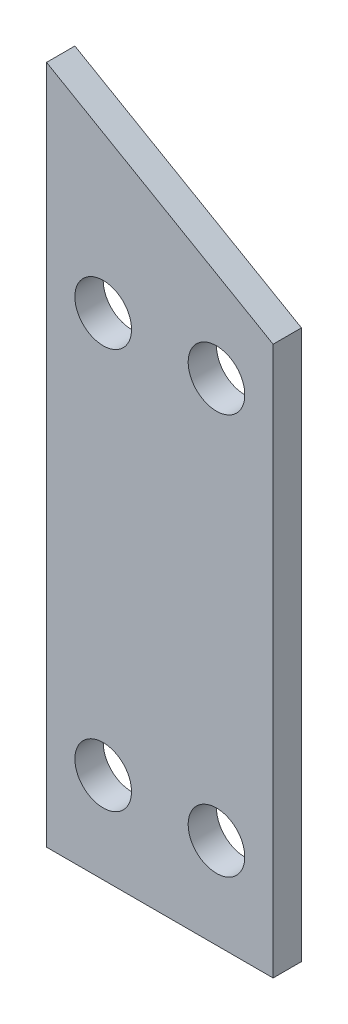
ISO-10303-21;
HEADER;
FILE_DESCRIPTION(('STEP AP214'),'2;1');
FILE_NAME('part.step','',(''),(''),'','','');
FILE_SCHEMA(('AUTOMOTIVE_DESIGN { 1 0 10303 214 1 1 1 1 }'));
ENDSEC;
DATA;
#1=APPLICATION_CONTEXT('core data for automotive mechanical design processes');
#2=APPLICATION_PROTOCOL_DEFINITION('international standard','automotive_design',2000,#1);
#3=PRODUCT_CONTEXT('',#1,'mechanical');
#4=PRODUCT('Part','Part','',(#3));
#5=PRODUCT_RELATED_PRODUCT_CATEGORY('part','',(#4));
#6=PRODUCT_DEFINITION_FORMATION('','',#4);
#7=PRODUCT_DEFINITION_CONTEXT('part definition',#1,'design');
#8=PRODUCT_DEFINITION('design','',#6,#7);
#9=PRODUCT_DEFINITION_SHAPE('','',#8);
#10=(LENGTH_UNIT() NAMED_UNIT(*) SI_UNIT(.MILLI.,.METRE.));
#11=(NAMED_UNIT(*) PLANE_ANGLE_UNIT() SI_UNIT($,.RADIAN.));
#12=(NAMED_UNIT(*) SI_UNIT($,.STERADIAN.) SOLID_ANGLE_UNIT());
#13=UNCERTAINTY_MEASURE_WITH_UNIT(LENGTH_MEASURE(1.E-05),#10,'distance_accuracy_value','');
#14=(GEOMETRIC_REPRESENTATION_CONTEXT(3) GLOBAL_UNCERTAINTY_ASSIGNED_CONTEXT((#13)) GLOBAL_UNIT_ASSIGNED_CONTEXT((#10,
#11,#12)) REPRESENTATION_CONTEXT('',''));
#15=CARTESIAN_POINT('',(0.,0.,0.));
#16=DIRECTION('',(0.,0.,1.));
#17=DIRECTION('',(1.,0.,0.));
#18=AXIS2_PLACEMENT_3D('',#15,#16,#17);
#19=CARTESIAN_POINT('',(0.,0.,4.7625));
#20=DIRECTION('',(0.,0.,-1.));
#21=DIRECTION('',(-1.,0.,0.));
#22=AXIS2_PLACEMENT_3D('',#19,#20,#21);
#23=PLANE('',#22);
#24=DIRECTION('',(0.,1.,0.));
#25=VECTOR('',#24,1.);
#26=CARTESIAN_POINT('',(0.,92.3029547438757,4.7625));
#27=LINE('',#26,#25);
#28=CARTESIAN_POINT('',(0.,0.,4.7625));
#29=VERTEX_POINT('',#28);
#30=CARTESIAN_POINT('',(0.,92.3029547438757,4.7625));
#31=VERTEX_POINT('',#30);
#32=EDGE_CURVE('E96',#29,#31,#27,.T.);
#33=ORIENTED_EDGE('',*,*,#32,.T.);
#34=DIRECTION('',(-0.866025403784443,0.499999999999992,0.));
#35=VECTOR('',#34,1.);
#36=CARTESIAN_POINT('',(-38.1,114.3,4.7625));
#37=LINE('',#36,#35);
#38=CARTESIAN_POINT('',(-38.1,114.3,4.7625));
#39=VERTEX_POINT('',#38);
#40=EDGE_CURVE('E91',#31,#39,#37,.T.);
#41=ORIENTED_EDGE('',*,*,#40,.T.);
#42=DIRECTION('',(0.,-1.,0.));
#43=VECTOR('',#42,1.);
#44=CARTESIAN_POINT('',(-38.1,0.,4.7625));
#45=LINE('',#44,#43);
#46=CARTESIAN_POINT('',(-38.1,0.,4.7625));
#47=VERTEX_POINT('',#46);
#48=EDGE_CURVE('E94',#39,#47,#45,.T.);
#49=ORIENTED_EDGE('',*,*,#48,.T.);
#50=DIRECTION('',(1.,0.,0.));
#51=VECTOR('',#50,1.);
#52=CARTESIAN_POINT('',(0.,0.,4.7625));
#53=LINE('',#52,#51);
#54=EDGE_CURVE('E61',#47,#29,#53,.T.);
#55=ORIENTED_EDGE('',*,*,#54,.T.);
#56=EDGE_LOOP('',(#33,#41,#49,#55));
#57=FACE_BOUND('',#56,.T.);
#58=CARTESIAN_POINT('',(-28.575,15.24,4.7625));
#59=DIRECTION('',(0.,0.,1.));
#60=DIRECTION('',(1.,0.,0.));
#61=AXIS2_PLACEMENT_3D('',#58,#59,#60);
#62=CIRCLE('',#61,4.7625);
#63=CARTESIAN_POINT('',(-33.3375,15.24,4.7625));
#64=VERTEX_POINT('',#63);
#65=EDGE_CURVE('E116',#64,#64,#62,.T.);
#66=ORIENTED_EDGE('',*,*,#65,.F.);
#67=EDGE_LOOP('',(#66));
#68=FACE_BOUND('',#67,.T.);
#69=CARTESIAN_POINT('',(-9.52499999999999,15.24,4.7625));
#70=DIRECTION('',(0.,0.,1.));
#71=DIRECTION('',(1.,0.,0.));
#72=AXIS2_PLACEMENT_3D('',#69,#70,#71);
#73=CIRCLE('',#72,4.7625);
#74=CARTESIAN_POINT('',(-14.2875,15.24,4.7625));
#75=VERTEX_POINT('',#74);
#76=EDGE_CURVE('E138',#75,#75,#73,.T.);
#77=ORIENTED_EDGE('',*,*,#76,.F.);
#78=EDGE_LOOP('',(#77));
#79=FACE_BOUND('',#78,.T.);
#80=CARTESIAN_POINT('',(-9.52499999999998,82.55,4.7625));
#81=DIRECTION('',(0.,0.,1.));
#82=DIRECTION('',(1.,0.,0.));
#83=AXIS2_PLACEMENT_3D('',#80,#81,#82);
#84=CIRCLE('',#83,4.76249999999999);
#85=CARTESIAN_POINT('',(-14.2875,82.55,4.7625));
#86=VERTEX_POINT('',#85);
#87=EDGE_CURVE('E146',#86,#86,#84,.T.);
#88=ORIENTED_EDGE('',*,*,#87,.F.);
#89=EDGE_LOOP('',(#88));
#90=FACE_BOUND('',#89,.T.);
#91=CARTESIAN_POINT('',(-28.575,82.55,4.7625));
#92=DIRECTION('',(0.,0.,1.));
#93=DIRECTION('',(1.,0.,0.));
#94=AXIS2_PLACEMENT_3D('',#91,#92,#93);
#95=CIRCLE('',#94,4.7625);
#96=CARTESIAN_POINT('',(-33.3375,82.55,4.7625));
#97=VERTEX_POINT('',#96);
#98=EDGE_CURVE('E154',#97,#97,#95,.T.);
#99=ORIENTED_EDGE('',*,*,#98,.F.);
#100=EDGE_LOOP('',(#99));
#101=FACE_BOUND('',#100,.T.);
#102=ADVANCED_FACE('F43',(#57,#68,#79,#90,#101),#23,.F.);
#103=CARTESIAN_POINT('',(0.,0.,0.));
#104=DIRECTION('',(0.,0.,-1.));
#105=DIRECTION('',(-1.,0.,0.));
#106=AXIS2_PLACEMENT_3D('',#103,#104,#105);
#107=PLANE('',#106);
#108=CARTESIAN_POINT('',(-9.52499999999998,82.55,0.));
#109=DIRECTION('',(0.,0.,1.));
#110=DIRECTION('',(1.,0.,0.));
#111=AXIS2_PLACEMENT_3D('',#108,#109,#110);
#112=CIRCLE('',#111,4.76249999999999);
#113=CARTESIAN_POINT('',(-14.2875,82.55,0.));
#114=VERTEX_POINT('',#113);
#115=EDGE_CURVE('E150',#114,#114,#112,.T.);
#116=ORIENTED_EDGE('',*,*,#115,.T.);
#117=EDGE_LOOP('',(#116));
#118=FACE_BOUND('',#117,.T.);
#119=CARTESIAN_POINT('',(-28.575,15.24,0.));
#120=DIRECTION('',(0.,0.,1.));
#121=DIRECTION('',(1.,0.,0.));
#122=AXIS2_PLACEMENT_3D('',#119,#120,#121);
#123=CIRCLE('',#122,4.7625);
#124=CARTESIAN_POINT('',(-33.3375,15.24,0.));
#125=VERTEX_POINT('',#124);
#126=EDGE_CURVE('E134',#125,#125,#123,.T.);
#127=ORIENTED_EDGE('',*,*,#126,.T.);
#128=EDGE_LOOP('',(#127));
#129=FACE_BOUND('',#128,.T.);
#130=DIRECTION('',(0.,1.,0.));
#131=VECTOR('',#130,1.);
#132=CARTESIAN_POINT('',(0.,92.3029547438757,0.));
#133=LINE('',#132,#131);
#134=CARTESIAN_POINT('',(0.,0.,0.));
#135=VERTEX_POINT('',#134);
#136=CARTESIAN_POINT('',(0.,92.3029547438757,0.));
#137=VERTEX_POINT('',#136);
#138=EDGE_CURVE('E112',#135,#137,#133,.T.);
#139=ORIENTED_EDGE('',*,*,#138,.F.);
#140=DIRECTION('',(1.,0.,0.));
#141=VECTOR('',#140,1.);
#142=CARTESIAN_POINT('',(0.,0.,0.));
#143=LINE('',#142,#141);
#144=CARTESIAN_POINT('',(-38.1,0.,0.));
#145=VERTEX_POINT('',#144);
#146=EDGE_CURVE('E84',#145,#135,#143,.T.);
#147=ORIENTED_EDGE('',*,*,#146,.F.);
#148=DIRECTION('',(0.,-1.,0.));
#149=VECTOR('',#148,1.);
#150=CARTESIAN_POINT('',(-38.1,0.,0.));
#151=LINE('',#150,#149);
#152=CARTESIAN_POINT('',(-38.1,114.3,0.));
#153=VERTEX_POINT('',#152);
#154=EDGE_CURVE('E78',#153,#145,#151,.T.);
#155=ORIENTED_EDGE('',*,*,#154,.F.);
#156=DIRECTION('',(-0.866025403784443,0.499999999999992,0.));
#157=VECTOR('',#156,1.);
#158=CARTESIAN_POINT('',(-38.1,114.3,0.));
#159=LINE('',#158,#157);
#160=EDGE_CURVE('E101',#137,#153,#159,.T.);
#161=ORIENTED_EDGE('',*,*,#160,.F.);
#162=EDGE_LOOP('',(#139,#147,#155,#161));
#163=FACE_BOUND('',#162,.T.);
#164=CARTESIAN_POINT('',(-9.52499999999999,15.24,0.));
#165=DIRECTION('',(0.,0.,1.));
#166=DIRECTION('',(1.,0.,0.));
#167=AXIS2_PLACEMENT_3D('',#164,#165,#166);
#168=CIRCLE('',#167,4.7625);
#169=CARTESIAN_POINT('',(-14.2875,15.24,0.));
#170=VERTEX_POINT('',#169);
#171=EDGE_CURVE('E142',#170,#170,#168,.T.);
#172=ORIENTED_EDGE('',*,*,#171,.T.);
#173=EDGE_LOOP('',(#172));
#174=FACE_BOUND('',#173,.T.);
#175=CARTESIAN_POINT('',(-28.575,82.55,0.));
#176=DIRECTION('',(0.,0.,1.));
#177=DIRECTION('',(1.,0.,0.));
#178=AXIS2_PLACEMENT_3D('',#175,#176,#177);
#179=CIRCLE('',#178,4.7625);
#180=CARTESIAN_POINT('',(-33.3375,82.55,0.));
#181=VERTEX_POINT('',#180);
#182=EDGE_CURVE('E158',#181,#181,#179,.T.);
#183=ORIENTED_EDGE('',*,*,#182,.T.);
#184=EDGE_LOOP('',(#183));
#185=FACE_BOUND('',#184,.T.);
#186=ADVANCED_FACE('F129',(#118,#129,#163,#174,#185),#107,.T.);
#187=CARTESIAN_POINT('',(0.,92.3029547438757,4.7625));
#188=DIRECTION('',(-1.,0.,0.));
#189=DIRECTION('',(0.,-1.,0.));
#190=AXIS2_PLACEMENT_3D('',#187,#188,#189);
#191=PLANE('',#190);
#192=ORIENTED_EDGE('',*,*,#138,.T.);
#193=DIRECTION('',(0.,0.,-1.));
#194=VECTOR('',#193,1.);
#195=CARTESIAN_POINT('',(0.,92.3029547438757,4.7625));
#196=LINE('',#195,#194);
#197=EDGE_CURVE('E11',#31,#137,#196,.T.);
#198=ORIENTED_EDGE('',*,*,#197,.F.);
#199=ORIENTED_EDGE('',*,*,#32,.F.);
#200=DIRECTION('',(0.,0.,-1.));
#201=VECTOR('',#200,1.);
#202=CARTESIAN_POINT('',(0.,0.,4.7625));
#203=LINE('',#202,#201);
#204=EDGE_CURVE('E108',#29,#135,#203,.T.);
#205=ORIENTED_EDGE('',*,*,#204,.T.);
#206=EDGE_LOOP('',(#192,#198,#199,#205));
#207=FACE_BOUND('',#206,.T.);
#208=ADVANCED_FACE('F45',(#207),#191,.F.);
#209=CARTESIAN_POINT('',(-38.1,114.3,4.7625));
#210=DIRECTION('',(-0.499999999999992,-0.866025403784444,0.));
#211=DIRECTION('',(0.866025403784444,-0.499999999999992,0.));
#212=AXIS2_PLACEMENT_3D('',#209,#210,#211);
#213=PLANE('',#212);
#214=ORIENTED_EDGE('',*,*,#160,.T.);
#215=DIRECTION('',(0.,0.,-1.));
#216=VECTOR('',#215,1.);
#217=CARTESIAN_POINT('',(-38.1,114.3,4.7625));
#218=LINE('',#217,#216);
#219=EDGE_CURVE('E53',#39,#153,#218,.T.);
#220=ORIENTED_EDGE('',*,*,#219,.F.);
#221=ORIENTED_EDGE('',*,*,#40,.F.);
#222=ORIENTED_EDGE('',*,*,#197,.T.);
#223=EDGE_LOOP('',(#214,#220,#221,#222));
#224=FACE_BOUND('',#223,.T.);
#225=ADVANCED_FACE('F100',(#224),#213,.F.);
#226=CARTESIAN_POINT('',(-38.1,0.,4.7625));
#227=DIRECTION('',(1.,0.,0.));
#228=DIRECTION('',(0.,0.,-1.));
#229=AXIS2_PLACEMENT_3D('',#226,#227,#228);
#230=PLANE('',#229);
#231=ORIENTED_EDGE('',*,*,#154,.T.);
#232=DIRECTION('',(0.,0.,-1.));
#233=VECTOR('',#232,1.);
#234=CARTESIAN_POINT('',(-38.1,0.,4.7625));
#235=LINE('',#234,#233);
#236=EDGE_CURVE('E103',#47,#145,#235,.T.);
#237=ORIENTED_EDGE('',*,*,#236,.F.);
#238=ORIENTED_EDGE('',*,*,#48,.F.);
#239=ORIENTED_EDGE('',*,*,#219,.T.);
#240=EDGE_LOOP('',(#231,#237,#238,#239));
#241=FACE_BOUND('',#240,.T.);
#242=ADVANCED_FACE('F104',(#241),#230,.F.);
#243=CARTESIAN_POINT('',(0.,0.,4.7625));
#244=DIRECTION('',(0.,1.,0.));
#245=DIRECTION('',(-1.,0.,0.));
#246=AXIS2_PLACEMENT_3D('',#243,#244,#245);
#247=PLANE('',#246);
#248=ORIENTED_EDGE('',*,*,#146,.T.);
#249=ORIENTED_EDGE('',*,*,#204,.F.);
#250=ORIENTED_EDGE('',*,*,#54,.F.);
#251=ORIENTED_EDGE('',*,*,#236,.T.);
#252=EDGE_LOOP('',(#248,#249,#250,#251));
#253=FACE_BOUND('',#252,.T.);
#254=ADVANCED_FACE('F126',(#253),#247,.F.);
#255=CARTESIAN_POINT('',(-28.575,15.24,4.7625));
#256=DIRECTION('',(0.,0.,-1.));
#257=DIRECTION('',(-1.,0.,0.));
#258=AXIS2_PLACEMENT_3D('',#255,#256,#257);
#259=CYLINDRICAL_SURFACE('',#258,4.7625);
#260=CARTESIAN_POINT('',(-33.3375,15.24,4.7625));
#261=CARTESIAN_POINT('',(-33.3375,15.24,4.712890625));
#262=CARTESIAN_POINT('',(-33.3375,15.24,4.66328125));
#263=CARTESIAN_POINT('',(-33.3375,15.24,4.5640625));
#264=CARTESIAN_POINT('',(-33.3375,15.24,4.514453125));
#265=CARTESIAN_POINT('',(-33.3375,15.24,4.415234375));
#266=CARTESIAN_POINT('',(-33.3375,15.24,4.365625));
#267=CARTESIAN_POINT('',(-33.3375,15.24,4.26640625));
#268=CARTESIAN_POINT('',(-33.3375,15.24,4.216796875));
#269=CARTESIAN_POINT('',(-33.3375,15.24,4.117578125));
#270=CARTESIAN_POINT('',(-33.3375,15.24,4.06796875));
#271=CARTESIAN_POINT('',(-33.3375,15.24,3.96875));
#272=CARTESIAN_POINT('',(-33.3375,15.24,3.919140625));
#273=CARTESIAN_POINT('',(-33.3375,15.24,3.819921875));
#274=CARTESIAN_POINT('',(-33.3375,15.24,3.7703125));
#275=CARTESIAN_POINT('',(-33.3375,15.24,3.67109375));
#276=CARTESIAN_POINT('',(-33.3375,15.24,3.621484375));
#277=CARTESIAN_POINT('',(-33.3375,15.24,3.522265625));
#278=CARTESIAN_POINT('',(-33.3375,15.24,3.47265625));
#279=CARTESIAN_POINT('',(-33.3375,15.24,3.3734375));
#280=CARTESIAN_POINT('',(-33.3375,15.24,3.323828125));
#281=CARTESIAN_POINT('',(-33.3375,15.24,3.224609375));
#282=CARTESIAN_POINT('',(-33.3375,15.24,3.175));
#283=CARTESIAN_POINT('',(-33.3375,15.24,3.07578125));
#284=CARTESIAN_POINT('',(-33.3375,15.24,3.026171875));
#285=CARTESIAN_POINT('',(-33.3375,15.24,2.926953125));
#286=CARTESIAN_POINT('',(-33.3375,15.24,2.87734375));
#287=CARTESIAN_POINT('',(-33.3375,15.24,2.778125));
#288=CARTESIAN_POINT('',(-33.3375,15.24,2.728515625));
#289=CARTESIAN_POINT('',(-33.3375,15.24,2.629296875));
#290=CARTESIAN_POINT('',(-33.3375,15.24,2.5796875));
#291=CARTESIAN_POINT('',(-33.3375,15.24,2.48046875));
#292=CARTESIAN_POINT('',(-33.3375,15.24,2.430859375));
#293=CARTESIAN_POINT('',(-33.3375,15.24,2.331640625));
#294=CARTESIAN_POINT('',(-33.3375,15.24,2.28203125));
#295=CARTESIAN_POINT('',(-33.3375,15.24,2.1828125));
#296=CARTESIAN_POINT('',(-33.3375,15.24,2.133203125));
#297=CARTESIAN_POINT('',(-33.3375,15.24,2.033984375));
#298=CARTESIAN_POINT('',(-33.3375,15.24,1.984375));
#299=CARTESIAN_POINT('',(-33.3375,15.24,1.88515625));
#300=CARTESIAN_POINT('',(-33.3375,15.24,1.835546875));
#301=CARTESIAN_POINT('',(-33.3375,15.24,1.736328125));
#302=CARTESIAN_POINT('',(-33.3375,15.24,1.68671875));
#303=CARTESIAN_POINT('',(-33.3375,15.24,1.5875));
#304=CARTESIAN_POINT('',(-33.3375,15.24,1.537890625));
#305=CARTESIAN_POINT('',(-33.3375,15.24,1.438671875));
#306=CARTESIAN_POINT('',(-33.3375,15.24,1.3890625));
#307=CARTESIAN_POINT('',(-33.3375,15.24,1.28984375));
#308=CARTESIAN_POINT('',(-33.3375,15.24,1.240234375));
#309=CARTESIAN_POINT('',(-33.3375,15.24,1.141015625));
#310=CARTESIAN_POINT('',(-33.3375,15.24,1.09140625));
#311=CARTESIAN_POINT('',(-33.3375,15.24,0.992187499999999));
#312=CARTESIAN_POINT('',(-33.3375,15.24,0.942578124999999));
#313=CARTESIAN_POINT('',(-33.3375,15.24,0.843359375));
#314=CARTESIAN_POINT('',(-33.3375,15.24,0.79375));
#315=CARTESIAN_POINT('',(-33.3375,15.24,0.69453125));
#316=CARTESIAN_POINT('',(-33.3375,15.24,0.644921875));
#317=CARTESIAN_POINT('',(-33.3375,15.24,0.545703125));
#318=CARTESIAN_POINT('',(-33.3375,15.24,0.49609375));
#319=CARTESIAN_POINT('',(-33.3375,15.24,0.396875));
#320=CARTESIAN_POINT('',(-33.3375,15.24,0.347265625));
#321=CARTESIAN_POINT('',(-33.3375,15.24,0.248046875));
#322=CARTESIAN_POINT('',(-33.3375,15.24,0.1984375));
#323=CARTESIAN_POINT('',(-33.3375,15.24,0.09921875));
#324=CARTESIAN_POINT('',(-33.3375,15.24,0.049609375));
#325=CARTESIAN_POINT('',(-33.3375,15.24,0.));
#326=B_SPLINE_CURVE_WITH_KNOTS('',3,(#260,#261,#262,#263,#264,#265,#266,#267,#268,#269,#270,
#271,#272,#273,#274,#275,#276,#277,#278,#279,#280,#281,#282,#283,#284,#285,#286,#287,#288,#289,
#290,#291,#292,#293,#294,#295,#296,#297,#298,#299,#300,#301,#302,#303,#304,#305,#306,#307,#308,
#309,#310,#311,#312,#313,#314,#315,#316,#317,#318,#319,#320,#321,#322,#323,#324,#325),
.UNSPECIFIED.,.F.,.F.,(4,2,2,2,2,2,2,2,2,2,2,2,2,2,2,2,2,2,2,2,2,2,2,2,2,2,2,2,2,2,2,2,4),(0.,
0.148828125,0.29765625,0.446484375,0.5953125,0.744140625,0.892968750000001,1.041796875,1.190625,
1.339453125,1.48828125,1.637109375,1.7859375,1.934765625,2.08359375,2.232421875,2.38125,
2.530078125,2.67890625,2.827734375,2.9765625,3.125390625,3.27421875,3.423046875,3.571875,
3.720703125,3.86953125,4.018359375,4.1671875,4.316015625,4.46484375,4.613671875,4.7625),.UNSPECIFIED.);
#327=EDGE_CURVE('BSEAM177',#64,#125,#326,.T.);
#328=ORIENTED_EDGE('',*,*,#65,.T.);
#329=ORIENTED_EDGE('',*,*,#126,.F.);
#330=ORIENTED_EDGE('',*,*,#327,.T.);
#331=ORIENTED_EDGE('',*,*,#327,.F.);
#332=EDGE_LOOP('',(#328,#330,#329,#331));
#333=FACE_BOUND('',#332,.T.);
#334=ADVANCED_FACE('F177',(#333),#259,.F.);
#335=CARTESIAN_POINT('',(-9.52499999999999,15.24,4.7625));
#336=DIRECTION('',(0.,0.,-1.));
#337=DIRECTION('',(-1.,0.,0.));
#338=AXIS2_PLACEMENT_3D('',#335,#336,#337);
#339=CYLINDRICAL_SURFACE('',#338,4.7625);
#340=CARTESIAN_POINT('',(-14.2875,15.24,4.7625));
#341=CARTESIAN_POINT('',(-14.2875,15.24,4.712890625));
#342=CARTESIAN_POINT('',(-14.2875,15.24,4.66328125));
#343=CARTESIAN_POINT('',(-14.2875,15.24,4.5640625));
#344=CARTESIAN_POINT('',(-14.2875,15.24,4.514453125));
#345=CARTESIAN_POINT('',(-14.2875,15.24,4.415234375));
#346=CARTESIAN_POINT('',(-14.2875,15.24,4.365625));
#347=CARTESIAN_POINT('',(-14.2875,15.24,4.26640625));
#348=CARTESIAN_POINT('',(-14.2875,15.24,4.216796875));
#349=CARTESIAN_POINT('',(-14.2875,15.24,4.117578125));
#350=CARTESIAN_POINT('',(-14.2875,15.24,4.06796875));
#351=CARTESIAN_POINT('',(-14.2875,15.24,3.96875));
#352=CARTESIAN_POINT('',(-14.2875,15.24,3.919140625));
#353=CARTESIAN_POINT('',(-14.2875,15.24,3.819921875));
#354=CARTESIAN_POINT('',(-14.2875,15.24,3.7703125));
#355=CARTESIAN_POINT('',(-14.2875,15.24,3.67109375));
#356=CARTESIAN_POINT('',(-14.2875,15.24,3.621484375));
#357=CARTESIAN_POINT('',(-14.2875,15.24,3.522265625));
#358=CARTESIAN_POINT('',(-14.2875,15.24,3.47265625));
#359=CARTESIAN_POINT('',(-14.2875,15.24,3.3734375));
#360=CARTESIAN_POINT('',(-14.2875,15.24,3.323828125));
#361=CARTESIAN_POINT('',(-14.2875,15.24,3.224609375));
#362=CARTESIAN_POINT('',(-14.2875,15.24,3.175));
#363=CARTESIAN_POINT('',(-14.2875,15.24,3.07578125));
#364=CARTESIAN_POINT('',(-14.2875,15.24,3.026171875));
#365=CARTESIAN_POINT('',(-14.2875,15.24,2.926953125));
#366=CARTESIAN_POINT('',(-14.2875,15.24,2.87734375));
#367=CARTESIAN_POINT('',(-14.2875,15.24,2.778125));
#368=CARTESIAN_POINT('',(-14.2875,15.24,2.728515625));
#369=CARTESIAN_POINT('',(-14.2875,15.24,2.629296875));
#370=CARTESIAN_POINT('',(-14.2875,15.24,2.5796875));
#371=CARTESIAN_POINT('',(-14.2875,15.24,2.48046875));
#372=CARTESIAN_POINT('',(-14.2875,15.24,2.430859375));
#373=CARTESIAN_POINT('',(-14.2875,15.24,2.331640625));
#374=CARTESIAN_POINT('',(-14.2875,15.24,2.28203125));
#375=CARTESIAN_POINT('',(-14.2875,15.24,2.1828125));
#376=CARTESIAN_POINT('',(-14.2875,15.24,2.133203125));
#377=CARTESIAN_POINT('',(-14.2875,15.24,2.033984375));
#378=CARTESIAN_POINT('',(-14.2875,15.24,1.984375));
#379=CARTESIAN_POINT('',(-14.2875,15.24,1.88515625));
#380=CARTESIAN_POINT('',(-14.2875,15.24,1.835546875));
#381=CARTESIAN_POINT('',(-14.2875,15.24,1.736328125));
#382=CARTESIAN_POINT('',(-14.2875,15.24,1.68671875));
#383=CARTESIAN_POINT('',(-14.2875,15.24,1.5875));
#384=CARTESIAN_POINT('',(-14.2875,15.24,1.537890625));
#385=CARTESIAN_POINT('',(-14.2875,15.24,1.438671875));
#386=CARTESIAN_POINT('',(-14.2875,15.24,1.3890625));
#387=CARTESIAN_POINT('',(-14.2875,15.24,1.28984375));
#388=CARTESIAN_POINT('',(-14.2875,15.24,1.240234375));
#389=CARTESIAN_POINT('',(-14.2875,15.24,1.141015625));
#390=CARTESIAN_POINT('',(-14.2875,15.24,1.09140625));
#391=CARTESIAN_POINT('',(-14.2875,15.24,0.992187499999999));
#392=CARTESIAN_POINT('',(-14.2875,15.24,0.942578124999999));
#393=CARTESIAN_POINT('',(-14.2875,15.24,0.843359375));
#394=CARTESIAN_POINT('',(-14.2875,15.24,0.79375));
#395=CARTESIAN_POINT('',(-14.2875,15.24,0.69453125));
#396=CARTESIAN_POINT('',(-14.2875,15.24,0.644921875));
#397=CARTESIAN_POINT('',(-14.2875,15.24,0.545703125));
#398=CARTESIAN_POINT('',(-14.2875,15.24,0.49609375));
#399=CARTESIAN_POINT('',(-14.2875,15.24,0.396875));
#400=CARTESIAN_POINT('',(-14.2875,15.24,0.347265625));
#401=CARTESIAN_POINT('',(-14.2875,15.24,0.248046875));
#402=CARTESIAN_POINT('',(-14.2875,15.24,0.1984375));
#403=CARTESIAN_POINT('',(-14.2875,15.24,0.09921875));
#404=CARTESIAN_POINT('',(-14.2875,15.24,0.049609375));
#405=CARTESIAN_POINT('',(-14.2875,15.24,0.));
#406=B_SPLINE_CURVE_WITH_KNOTS('',3,(#340,#341,#342,#343,#344,#345,#346,#347,#348,#349,#350,
#351,#352,#353,#354,#355,#356,#357,#358,#359,#360,#361,#362,#363,#364,#365,#366,#367,#368,#369,
#370,#371,#372,#373,#374,#375,#376,#377,#378,#379,#380,#381,#382,#383,#384,#385,#386,#387,#388,
#389,#390,#391,#392,#393,#394,#395,#396,#397,#398,#399,#400,#401,#402,#403,#404,#405),
.UNSPECIFIED.,.F.,.F.,(4,2,2,2,2,2,2,2,2,2,2,2,2,2,2,2,2,2,2,2,2,2,2,2,2,2,2,2,2,2,2,2,4),(0.,
0.148828125,0.29765625,0.446484375,0.5953125,0.744140625,0.892968750000001,1.041796875,1.190625,
1.339453125,1.48828125,1.637109375,1.7859375,1.934765625,2.08359375,2.232421875,2.38125,
2.530078125,2.67890625,2.827734375,2.9765625,3.125390625,3.27421875,3.423046875,3.571875,
3.720703125,3.86953125,4.018359375,4.1671875,4.316015625,4.46484375,4.613671875,4.7625),.UNSPECIFIED.);
#407=EDGE_CURVE('BSEAM231',#75,#170,#406,.T.);
#408=ORIENTED_EDGE('',*,*,#76,.T.);
#409=ORIENTED_EDGE('',*,*,#171,.F.);
#410=ORIENTED_EDGE('',*,*,#407,.T.);
#411=ORIENTED_EDGE('',*,*,#407,.F.);
#412=EDGE_LOOP('',(#408,#410,#409,#411));
#413=FACE_BOUND('',#412,.T.);
#414=ADVANCED_FACE('F231',(#413),#339,.F.);
#415=CARTESIAN_POINT('',(-9.52499999999998,82.55,4.7625));
#416=DIRECTION('',(0.,0.,-1.));
#417=DIRECTION('',(-1.,0.,0.));
#418=AXIS2_PLACEMENT_3D('',#415,#416,#417);
#419=CYLINDRICAL_SURFACE('',#418,4.76249999999999);
#420=CARTESIAN_POINT('',(-14.2875,82.55,4.7625));
#421=CARTESIAN_POINT('',(-14.2875,82.55,4.712890625));
#422=CARTESIAN_POINT('',(-14.2875,82.55,4.66328125));
#423=CARTESIAN_POINT('',(-14.2875,82.55,4.5640625));
#424=CARTESIAN_POINT('',(-14.2875,82.55,4.514453125));
#425=CARTESIAN_POINT('',(-14.2875,82.55,4.415234375));
#426=CARTESIAN_POINT('',(-14.2875,82.55,4.365625));
#427=CARTESIAN_POINT('',(-14.2875,82.55,4.26640625));
#428=CARTESIAN_POINT('',(-14.2875,82.55,4.216796875));
#429=CARTESIAN_POINT('',(-14.2875,82.55,4.117578125));
#430=CARTESIAN_POINT('',(-14.2875,82.55,4.06796875));
#431=CARTESIAN_POINT('',(-14.2875,82.55,3.96875));
#432=CARTESIAN_POINT('',(-14.2875,82.55,3.919140625));
#433=CARTESIAN_POINT('',(-14.2875,82.55,3.819921875));
#434=CARTESIAN_POINT('',(-14.2875,82.55,3.7703125));
#435=CARTESIAN_POINT('',(-14.2875,82.55,3.67109375));
#436=CARTESIAN_POINT('',(-14.2875,82.55,3.621484375));
#437=CARTESIAN_POINT('',(-14.2875,82.55,3.522265625));
#438=CARTESIAN_POINT('',(-14.2875,82.55,3.47265625));
#439=CARTESIAN_POINT('',(-14.2875,82.55,3.3734375));
#440=CARTESIAN_POINT('',(-14.2875,82.55,3.323828125));
#441=CARTESIAN_POINT('',(-14.2875,82.55,3.224609375));
#442=CARTESIAN_POINT('',(-14.2875,82.55,3.175));
#443=CARTESIAN_POINT('',(-14.2875,82.55,3.07578125));
#444=CARTESIAN_POINT('',(-14.2875,82.55,3.026171875));
#445=CARTESIAN_POINT('',(-14.2875,82.55,2.926953125));
#446=CARTESIAN_POINT('',(-14.2875,82.55,2.87734375));
#447=CARTESIAN_POINT('',(-14.2875,82.55,2.778125));
#448=CARTESIAN_POINT('',(-14.2875,82.55,2.728515625));
#449=CARTESIAN_POINT('',(-14.2875,82.55,2.629296875));
#450=CARTESIAN_POINT('',(-14.2875,82.55,2.5796875));
#451=CARTESIAN_POINT('',(-14.2875,82.55,2.48046875));
#452=CARTESIAN_POINT('',(-14.2875,82.55,2.430859375));
#453=CARTESIAN_POINT('',(-14.2875,82.55,2.331640625));
#454=CARTESIAN_POINT('',(-14.2875,82.55,2.28203125));
#455=CARTESIAN_POINT('',(-14.2875,82.55,2.1828125));
#456=CARTESIAN_POINT('',(-14.2875,82.55,2.133203125));
#457=CARTESIAN_POINT('',(-14.2875,82.55,2.033984375));
#458=CARTESIAN_POINT('',(-14.2875,82.55,1.984375));
#459=CARTESIAN_POINT('',(-14.2875,82.55,1.88515625));
#460=CARTESIAN_POINT('',(-14.2875,82.55,1.835546875));
#461=CARTESIAN_POINT('',(-14.2875,82.55,1.736328125));
#462=CARTESIAN_POINT('',(-14.2875,82.55,1.68671875));
#463=CARTESIAN_POINT('',(-14.2875,82.55,1.5875));
#464=CARTESIAN_POINT('',(-14.2875,82.55,1.537890625));
#465=CARTESIAN_POINT('',(-14.2875,82.55,1.438671875));
#466=CARTESIAN_POINT('',(-14.2875,82.55,1.3890625));
#467=CARTESIAN_POINT('',(-14.2875,82.55,1.28984375));
#468=CARTESIAN_POINT('',(-14.2875,82.55,1.240234375));
#469=CARTESIAN_POINT('',(-14.2875,82.55,1.141015625));
#470=CARTESIAN_POINT('',(-14.2875,82.55,1.09140625));
#471=CARTESIAN_POINT('',(-14.2875,82.55,0.992187499999999));
#472=CARTESIAN_POINT('',(-14.2875,82.55,0.942578124999999));
#473=CARTESIAN_POINT('',(-14.2875,82.55,0.843359375));
#474=CARTESIAN_POINT('',(-14.2875,82.55,0.79375));
#475=CARTESIAN_POINT('',(-14.2875,82.55,0.69453125));
#476=CARTESIAN_POINT('',(-14.2875,82.55,0.644921875));
#477=CARTESIAN_POINT('',(-14.2875,82.55,0.545703125));
#478=CARTESIAN_POINT('',(-14.2875,82.55,0.49609375));
#479=CARTESIAN_POINT('',(-14.2875,82.55,0.396875));
#480=CARTESIAN_POINT('',(-14.2875,82.55,0.347265625));
#481=CARTESIAN_POINT('',(-14.2875,82.55,0.248046875));
#482=CARTESIAN_POINT('',(-14.2875,82.55,0.1984375));
#483=CARTESIAN_POINT('',(-14.2875,82.55,0.09921875));
#484=CARTESIAN_POINT('',(-14.2875,82.55,0.049609375));
#485=CARTESIAN_POINT('',(-14.2875,82.55,0.));
#486=B_SPLINE_CURVE_WITH_KNOTS('',3,(#420,#421,#422,#423,#424,#425,#426,#427,#428,#429,#430,
#431,#432,#433,#434,#435,#436,#437,#438,#439,#440,#441,#442,#443,#444,#445,#446,#447,#448,#449,
#450,#451,#452,#453,#454,#455,#456,#457,#458,#459,#460,#461,#462,#463,#464,#465,#466,#467,#468,
#469,#470,#471,#472,#473,#474,#475,#476,#477,#478,#479,#480,#481,#482,#483,#484,#485),
.UNSPECIFIED.,.F.,.F.,(4,2,2,2,2,2,2,2,2,2,2,2,2,2,2,2,2,2,2,2,2,2,2,2,2,2,2,2,2,2,2,2,4),(0.,
0.148828125,0.29765625,0.446484375,0.5953125,0.744140625,0.892968750000001,1.041796875,1.190625,
1.339453125,1.48828125,1.637109375,1.7859375,1.934765625,2.08359375,2.232421875,2.38125,
2.530078125,2.67890625,2.827734375,2.9765625,3.125390625,3.27421875,3.423046875,3.571875,
3.720703125,3.86953125,4.018359375,4.1671875,4.316015625,4.46484375,4.613671875,4.7625),.UNSPECIFIED.);
#487=EDGE_CURVE('BSEAM240',#86,#114,#486,.T.);
#488=ORIENTED_EDGE('',*,*,#87,.T.);
#489=ORIENTED_EDGE('',*,*,#115,.F.);
#490=ORIENTED_EDGE('',*,*,#487,.T.);
#491=ORIENTED_EDGE('',*,*,#487,.F.);
#492=EDGE_LOOP('',(#488,#490,#489,#491));
#493=FACE_BOUND('',#492,.T.);
#494=ADVANCED_FACE('F240',(#493),#419,.F.);
#495=CARTESIAN_POINT('',(-28.575,82.55,4.7625));
#496=DIRECTION('',(0.,0.,-1.));
#497=DIRECTION('',(-1.,0.,0.));
#498=AXIS2_PLACEMENT_3D('',#495,#496,#497);
#499=CYLINDRICAL_SURFACE('',#498,4.7625);
#500=CARTESIAN_POINT('',(-33.3375,82.55,4.7625));
#501=CARTESIAN_POINT('',(-33.3375,82.55,4.712890625));
#502=CARTESIAN_POINT('',(-33.3375,82.55,4.66328125));
#503=CARTESIAN_POINT('',(-33.3375,82.55,4.5640625));
#504=CARTESIAN_POINT('',(-33.3375,82.55,4.514453125));
#505=CARTESIAN_POINT('',(-33.3375,82.55,4.415234375));
#506=CARTESIAN_POINT('',(-33.3375,82.55,4.365625));
#507=CARTESIAN_POINT('',(-33.3375,82.55,4.26640625));
#508=CARTESIAN_POINT('',(-33.3375,82.55,4.216796875));
#509=CARTESIAN_POINT('',(-33.3375,82.55,4.117578125));
#510=CARTESIAN_POINT('',(-33.3375,82.55,4.06796875));
#511=CARTESIAN_POINT('',(-33.3375,82.55,3.96875));
#512=CARTESIAN_POINT('',(-33.3375,82.55,3.919140625));
#513=CARTESIAN_POINT('',(-33.3375,82.55,3.819921875));
#514=CARTESIAN_POINT('',(-33.3375,82.55,3.7703125));
#515=CARTESIAN_POINT('',(-33.3375,82.55,3.67109375));
#516=CARTESIAN_POINT('',(-33.3375,82.55,3.621484375));
#517=CARTESIAN_POINT('',(-33.3375,82.55,3.522265625));
#518=CARTESIAN_POINT('',(-33.3375,82.55,3.47265625));
#519=CARTESIAN_POINT('',(-33.3375,82.55,3.3734375));
#520=CARTESIAN_POINT('',(-33.3375,82.55,3.323828125));
#521=CARTESIAN_POINT('',(-33.3375,82.55,3.224609375));
#522=CARTESIAN_POINT('',(-33.3375,82.55,3.175));
#523=CARTESIAN_POINT('',(-33.3375,82.55,3.07578125));
#524=CARTESIAN_POINT('',(-33.3375,82.55,3.026171875));
#525=CARTESIAN_POINT('',(-33.3375,82.55,2.926953125));
#526=CARTESIAN_POINT('',(-33.3375,82.55,2.87734375));
#527=CARTESIAN_POINT('',(-33.3375,82.55,2.778125));
#528=CARTESIAN_POINT('',(-33.3375,82.55,2.728515625));
#529=CARTESIAN_POINT('',(-33.3375,82.55,2.629296875));
#530=CARTESIAN_POINT('',(-33.3375,82.55,2.5796875));
#531=CARTESIAN_POINT('',(-33.3375,82.55,2.48046875));
#532=CARTESIAN_POINT('',(-33.3375,82.55,2.430859375));
#533=CARTESIAN_POINT('',(-33.3375,82.55,2.331640625));
#534=CARTESIAN_POINT('',(-33.3375,82.55,2.28203125));
#535=CARTESIAN_POINT('',(-33.3375,82.55,2.1828125));
#536=CARTESIAN_POINT('',(-33.3375,82.55,2.133203125));
#537=CARTESIAN_POINT('',(-33.3375,82.55,2.033984375));
#538=CARTESIAN_POINT('',(-33.3375,82.55,1.984375));
#539=CARTESIAN_POINT('',(-33.3375,82.55,1.88515625));
#540=CARTESIAN_POINT('',(-33.3375,82.55,1.835546875));
#541=CARTESIAN_POINT('',(-33.3375,82.55,1.736328125));
#542=CARTESIAN_POINT('',(-33.3375,82.55,1.68671875));
#543=CARTESIAN_POINT('',(-33.3375,82.55,1.5875));
#544=CARTESIAN_POINT('',(-33.3375,82.55,1.537890625));
#545=CARTESIAN_POINT('',(-33.3375,82.55,1.438671875));
#546=CARTESIAN_POINT('',(-33.3375,82.55,1.3890625));
#547=CARTESIAN_POINT('',(-33.3375,82.55,1.28984375));
#548=CARTESIAN_POINT('',(-33.3375,82.55,1.240234375));
#549=CARTESIAN_POINT('',(-33.3375,82.55,1.141015625));
#550=CARTESIAN_POINT('',(-33.3375,82.55,1.09140625));
#551=CARTESIAN_POINT('',(-33.3375,82.55,0.992187499999999));
#552=CARTESIAN_POINT('',(-33.3375,82.55,0.942578124999999));
#553=CARTESIAN_POINT('',(-33.3375,82.55,0.843359375));
#554=CARTESIAN_POINT('',(-33.3375,82.55,0.79375));
#555=CARTESIAN_POINT('',(-33.3375,82.55,0.69453125));
#556=CARTESIAN_POINT('',(-33.3375,82.55,0.644921875));
#557=CARTESIAN_POINT('',(-33.3375,82.55,0.545703125));
#558=CARTESIAN_POINT('',(-33.3375,82.55,0.49609375));
#559=CARTESIAN_POINT('',(-33.3375,82.55,0.396875));
#560=CARTESIAN_POINT('',(-33.3375,82.55,0.347265625));
#561=CARTESIAN_POINT('',(-33.3375,82.55,0.248046875));
#562=CARTESIAN_POINT('',(-33.3375,82.55,0.1984375));
#563=CARTESIAN_POINT('',(-33.3375,82.55,0.09921875));
#564=CARTESIAN_POINT('',(-33.3375,82.55,0.049609375));
#565=CARTESIAN_POINT('',(-33.3375,82.55,0.));
#566=B_SPLINE_CURVE_WITH_KNOTS('',3,(#500,#501,#502,#503,#504,#505,#506,#507,#508,#509,#510,
#511,#512,#513,#514,#515,#516,#517,#518,#519,#520,#521,#522,#523,#524,#525,#526,#527,#528,#529,
#530,#531,#532,#533,#534,#535,#536,#537,#538,#539,#540,#541,#542,#543,#544,#545,#546,#547,#548,
#549,#550,#551,#552,#553,#554,#555,#556,#557,#558,#559,#560,#561,#562,#563,#564,#565),
.UNSPECIFIED.,.F.,.F.,(4,2,2,2,2,2,2,2,2,2,2,2,2,2,2,2,2,2,2,2,2,2,2,2,2,2,2,2,2,2,2,2,4),(0.,
0.148828125,0.29765625,0.446484375,0.5953125,0.744140625,0.892968750000001,1.041796875,1.190625,
1.339453125,1.48828125,1.637109375,1.7859375,1.934765625,2.08359375,2.232421875,2.38125,
2.530078125,2.67890625,2.827734375,2.9765625,3.125390625,3.27421875,3.423046875,3.571875,
3.720703125,3.86953125,4.018359375,4.1671875,4.316015625,4.46484375,4.613671875,4.7625),.UNSPECIFIED.);
#567=EDGE_CURVE('BSEAM166',#97,#181,#566,.T.);
#568=ORIENTED_EDGE('',*,*,#98,.T.);
#569=ORIENTED_EDGE('',*,*,#182,.F.);
#570=ORIENTED_EDGE('',*,*,#567,.T.);
#571=ORIENTED_EDGE('',*,*,#567,.F.);
#572=EDGE_LOOP('',(#568,#570,#569,#571));
#573=FACE_BOUND('',#572,.T.);
#574=ADVANCED_FACE('F166',(#573),#499,.F.);
#575=CLOSED_SHELL('',(#102,#186,#208,#225,#242,#254,#334,#414,#494,#574));
#576=MANIFOLD_SOLID_BREP('B2',#575);
#577=ADVANCED_BREP_SHAPE_REPRESENTATION('',(#18,#576),#14);
#578=SHAPE_DEFINITION_REPRESENTATION(#9,#577);
ENDSEC;
END-ISO-10303-21;
